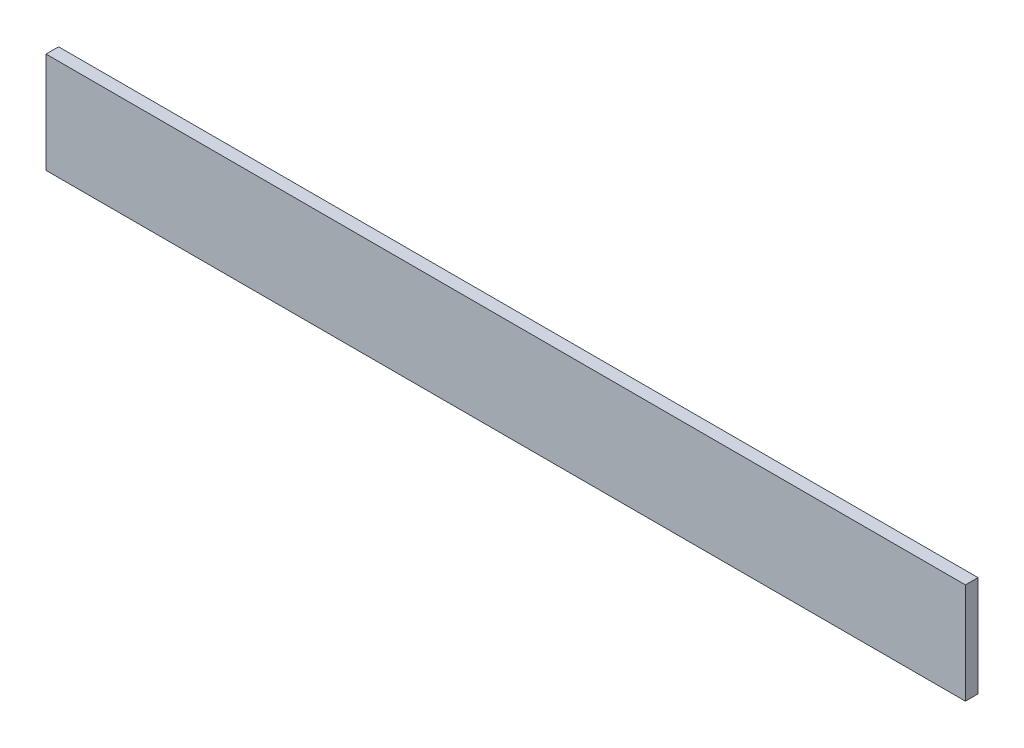
ISO-10303-21;
HEADER;
FILE_DESCRIPTION(('STEP AP214'),'2;1');
FILE_NAME('part.step','',(''),(''),'','','');
FILE_SCHEMA(('AUTOMOTIVE_DESIGN { 1 0 10303 214 1 1 1 1 }'));
ENDSEC;
DATA;
#1=APPLICATION_CONTEXT('core data for automotive mechanical design processes');
#2=APPLICATION_PROTOCOL_DEFINITION('international standard','automotive_design',2000,#1);
#3=PRODUCT_CONTEXT('',#1,'mechanical');
#4=PRODUCT('Part','Part','',(#3));
#5=PRODUCT_RELATED_PRODUCT_CATEGORY('part','',(#4));
#6=PRODUCT_DEFINITION_FORMATION('','',#4);
#7=PRODUCT_DEFINITION_CONTEXT('part definition',#1,'design');
#8=PRODUCT_DEFINITION('design','',#6,#7);
#9=PRODUCT_DEFINITION_SHAPE('','',#8);
#10=(LENGTH_UNIT() NAMED_UNIT(*) SI_UNIT(.MILLI.,.METRE.));
#11=(NAMED_UNIT(*) PLANE_ANGLE_UNIT() SI_UNIT($,.RADIAN.));
#12=(NAMED_UNIT(*) SI_UNIT($,.STERADIAN.) SOLID_ANGLE_UNIT());
#13=UNCERTAINTY_MEASURE_WITH_UNIT(LENGTH_MEASURE(1.E-05),#10,'distance_accuracy_value','');
#14=(GEOMETRIC_REPRESENTATION_CONTEXT(3) GLOBAL_UNCERTAINTY_ASSIGNED_CONTEXT((#13)) GLOBAL_UNIT_ASSIGNED_CONTEXT((#10,
#11,#12)) REPRESENTATION_CONTEXT('',''));
#15=CARTESIAN_POINT('',(0.,0.,0.));
#16=DIRECTION('',(0.,0.,1.));
#17=DIRECTION('',(1.,0.,0.));
#18=AXIS2_PLACEMENT_3D('',#15,#16,#17);
#19=CARTESIAN_POINT('',(182.5,20.,5.));
#20=DIRECTION('',(-1.,0.,0.));
#21=DIRECTION('',(0.,0.,1.));
#22=AXIS2_PLACEMENT_3D('',#19,#20,#21);
#23=PLANE('',#22);
#24=DIRECTION('',(0.,1.,0.));
#25=VECTOR('',#24,1.);
#26=CARTESIAN_POINT('',(182.5,20.,0.));
#27=LINE('',#26,#25);
#28=CARTESIAN_POINT('',(182.5,-20.,0.));
#29=VERTEX_POINT('',#28);
#30=CARTESIAN_POINT('',(182.5,20.,0.));
#31=VERTEX_POINT('',#30);
#32=EDGE_CURVE('E96',#29,#31,#27,.T.);
#33=ORIENTED_EDGE('',*,*,#32,.T.);
#34=DIRECTION('',(0.,0.,-1.));
#35=VECTOR('',#34,1.);
#36=CARTESIAN_POINT('',(182.5,20.,5.));
#37=LINE('',#36,#35);
#38=CARTESIAN_POINT('',(182.5,20.,5.));
#39=VERTEX_POINT('',#38);
#40=EDGE_CURVE('E11',#39,#31,#37,.T.);
#41=ORIENTED_EDGE('',*,*,#40,.F.);
#42=DIRECTION('',(0.,1.,0.));
#43=VECTOR('',#42,1.);
#44=CARTESIAN_POINT('',(182.5,20.,5.));
#45=LINE('',#44,#43);
#46=CARTESIAN_POINT('',(182.5,-20.,5.));
#47=VERTEX_POINT('',#46);
#48=EDGE_CURVE('E84',#47,#39,#45,.T.);
#49=ORIENTED_EDGE('',*,*,#48,.F.);
#50=DIRECTION('',(0.,0.,-1.));
#51=VECTOR('',#50,1.);
#52=CARTESIAN_POINT('',(182.5,-20.,5.));
#53=LINE('',#52,#51);
#54=EDGE_CURVE('E92',#47,#29,#53,.T.);
#55=ORIENTED_EDGE('',*,*,#54,.T.);
#56=EDGE_LOOP('',(#33,#41,#49,#55));
#57=FACE_BOUND('',#56,.T.);
#58=ADVANCED_FACE('F33',(#57),#23,.F.);
#59=CARTESIAN_POINT('',(-182.5,20.,5.));
#60=DIRECTION('',(0.,-1.,0.));
#61=DIRECTION('',(0.,0.,-1.));
#62=AXIS2_PLACEMENT_3D('',#59,#60,#61);
#63=PLANE('',#62);
#64=DIRECTION('',(-1.,0.,0.));
#65=VECTOR('',#64,1.);
#66=CARTESIAN_POINT('',(-182.5,20.,0.));
#67=LINE('',#66,#65);
#68=CARTESIAN_POINT('',(-182.5,20.,0.));
#69=VERTEX_POINT('',#68);
#70=EDGE_CURVE('E88',#31,#69,#67,.T.);
#71=ORIENTED_EDGE('',*,*,#70,.T.);
#72=DIRECTION('',(0.,0.,-1.));
#73=VECTOR('',#72,1.);
#74=CARTESIAN_POINT('',(-182.5,20.,5.));
#75=LINE('',#74,#73);
#76=CARTESIAN_POINT('',(-182.5,20.,5.));
#77=VERTEX_POINT('',#76);
#78=EDGE_CURVE('E41',#77,#69,#75,.T.);
#79=ORIENTED_EDGE('',*,*,#78,.F.);
#80=DIRECTION('',(-1.,0.,0.));
#81=VECTOR('',#80,1.);
#82=CARTESIAN_POINT('',(-182.5,20.,5.));
#83=LINE('',#82,#81);
#84=EDGE_CURVE('E79',#39,#77,#83,.T.);
#85=ORIENTED_EDGE('',*,*,#84,.F.);
#86=ORIENTED_EDGE('',*,*,#40,.T.);
#87=EDGE_LOOP('',(#71,#79,#85,#86));
#88=FACE_BOUND('',#87,.T.);
#89=ADVANCED_FACE('F87',(#88),#63,.F.);
#90=CARTESIAN_POINT('',(-182.5,20.,5.));
#91=DIRECTION('',(1.,0.,0.));
#92=DIRECTION('',(0.,0.,-1.));
#93=AXIS2_PLACEMENT_3D('',#90,#91,#92);
#94=PLANE('',#93);
#95=DIRECTION('',(0.,-1.,0.));
#96=VECTOR('',#95,1.);
#97=CARTESIAN_POINT('',(-182.5,20.,0.));
#98=LINE('',#97,#96);
#99=CARTESIAN_POINT('',(-182.5,-20.,0.));
#100=VERTEX_POINT('',#99);
#101=EDGE_CURVE('E66',#69,#100,#98,.T.);
#102=ORIENTED_EDGE('',*,*,#101,.T.);
#103=DIRECTION('',(0.,0.,-1.));
#104=VECTOR('',#103,1.);
#105=CARTESIAN_POINT('',(-182.5,-20.,5.));
#106=LINE('',#105,#104);
#107=CARTESIAN_POINT('',(-182.5,-20.,5.));
#108=VERTEX_POINT('',#107);
#109=EDGE_CURVE('E89',#108,#100,#106,.T.);
#110=ORIENTED_EDGE('',*,*,#109,.F.);
#111=DIRECTION('',(0.,-1.,0.));
#112=VECTOR('',#111,1.);
#113=CARTESIAN_POINT('',(-182.5,20.,5.));
#114=LINE('',#113,#112);
#115=EDGE_CURVE('E82',#77,#108,#114,.T.);
#116=ORIENTED_EDGE('',*,*,#115,.F.);
#117=ORIENTED_EDGE('',*,*,#78,.T.);
#118=EDGE_LOOP('',(#102,#110,#116,#117));
#119=FACE_BOUND('',#118,.T.);
#120=ADVANCED_FACE('F90',(#119),#94,.F.);
#121=CARTESIAN_POINT('',(-182.5,-20.,5.));
#122=DIRECTION('',(0.,1.,0.));
#123=DIRECTION('',(0.,0.,1.));
#124=AXIS2_PLACEMENT_3D('',#121,#122,#123);
#125=PLANE('',#124);
#126=DIRECTION('',(1.,0.,0.));
#127=VECTOR('',#126,1.);
#128=CARTESIAN_POINT('',(-182.5,-20.,0.));
#129=LINE('',#128,#127);
#130=EDGE_CURVE('E72',#100,#29,#129,.T.);
#131=ORIENTED_EDGE('',*,*,#130,.T.);
#132=ORIENTED_EDGE('',*,*,#54,.F.);
#133=DIRECTION('',(1.,0.,0.));
#134=VECTOR('',#133,1.);
#135=CARTESIAN_POINT('',(-182.5,-20.,5.));
#136=LINE('',#135,#134);
#137=EDGE_CURVE('E49',#108,#47,#136,.T.);
#138=ORIENTED_EDGE('',*,*,#137,.F.);
#139=ORIENTED_EDGE('',*,*,#109,.T.);
#140=EDGE_LOOP('',(#131,#132,#138,#139));
#141=FACE_BOUND('',#140,.T.);
#142=ADVANCED_FACE('F103',(#141),#125,.F.);
#143=CARTESIAN_POINT('',(0.,0.,5.));
#144=DIRECTION('',(0.,0.,1.));
#145=DIRECTION('',(1.,0.,0.));
#146=AXIS2_PLACEMENT_3D('',#143,#144,#145);
#147=PLANE('',#146);
#148=ORIENTED_EDGE('',*,*,#48,.T.);
#149=ORIENTED_EDGE('',*,*,#84,.T.);
#150=ORIENTED_EDGE('',*,*,#115,.T.);
#151=ORIENTED_EDGE('',*,*,#137,.T.);
#152=EDGE_LOOP('',(#148,#149,#150,#151));
#153=FACE_BOUND('',#152,.T.);
#154=ADVANCED_FACE('F80',(#153),#147,.T.);
#155=CARTESIAN_POINT('',(0.,0.,0.));
#156=DIRECTION('',(0.,0.,1.));
#157=DIRECTION('',(1.,0.,0.));
#158=AXIS2_PLACEMENT_3D('',#155,#156,#157);
#159=PLANE('',#158);
#160=ORIENTED_EDGE('',*,*,#32,.F.);
#161=ORIENTED_EDGE('',*,*,#130,.F.);
#162=ORIENTED_EDGE('',*,*,#101,.F.);
#163=ORIENTED_EDGE('',*,*,#70,.F.);
#164=EDGE_LOOP('',(#160,#161,#162,#163));
#165=FACE_BOUND('',#164,.T.);
#166=ADVANCED_FACE('F106',(#165),#159,.F.);
#167=CLOSED_SHELL('',(#58,#89,#120,#142,#154,#166));
#168=MANIFOLD_SOLID_BREP('B2',#167);
#169=ADVANCED_BREP_SHAPE_REPRESENTATION('',(#18,#168),#14);
#170=SHAPE_DEFINITION_REPRESENTATION(#9,#169);
ENDSEC;
END-ISO-10303-21;
